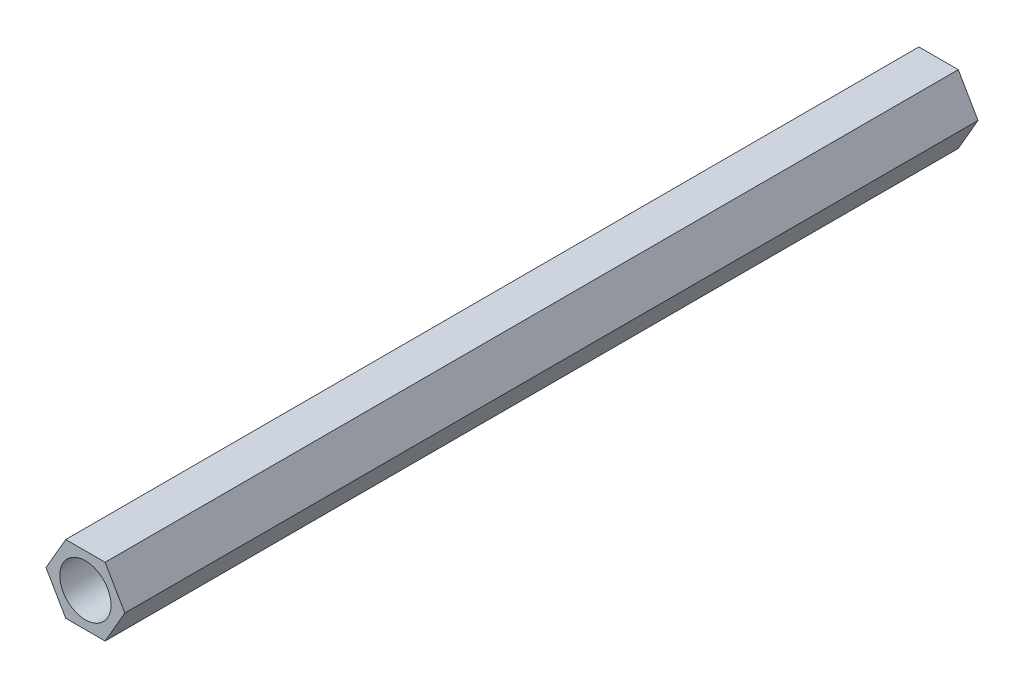
ISO-10303-21;
HEADER;
FILE_DESCRIPTION(('STEP AP214'),'2;1');
FILE_NAME('part.step','',(''),(''),'','','');
FILE_SCHEMA(('AUTOMOTIVE_DESIGN { 1 0 10303 214 1 1 1 1 }'));
ENDSEC;
DATA;
#1=APPLICATION_CONTEXT('core data for automotive mechanical design processes');
#2=APPLICATION_PROTOCOL_DEFINITION('international standard','automotive_design',2000,#1);
#3=PRODUCT_CONTEXT('',#1,'mechanical');
#4=PRODUCT('Part','Part','',(#3));
#5=PRODUCT_RELATED_PRODUCT_CATEGORY('part','',(#4));
#6=PRODUCT_DEFINITION_FORMATION('','',#4);
#7=PRODUCT_DEFINITION_CONTEXT('part definition',#1,'design');
#8=PRODUCT_DEFINITION('design','',#6,#7);
#9=PRODUCT_DEFINITION_SHAPE('','',#8);
#10=(LENGTH_UNIT() NAMED_UNIT(*) SI_UNIT(.MILLI.,.METRE.));
#11=(NAMED_UNIT(*) PLANE_ANGLE_UNIT() SI_UNIT($,.RADIAN.));
#12=(NAMED_UNIT(*) SI_UNIT($,.STERADIAN.) SOLID_ANGLE_UNIT());
#13=UNCERTAINTY_MEASURE_WITH_UNIT(LENGTH_MEASURE(1.E-05),#10,'distance_accuracy_value','');
#14=(GEOMETRIC_REPRESENTATION_CONTEXT(3) GLOBAL_UNCERTAINTY_ASSIGNED_CONTEXT((#13)) GLOBAL_UNIT_ASSIGNED_CONTEXT((#10,
#11,#12)) REPRESENTATION_CONTEXT('',''));
#15=CARTESIAN_POINT('',(0.,0.,0.));
#16=DIRECTION('',(0.,0.,1.));
#17=DIRECTION('',(1.,0.,0.));
#18=AXIS2_PLACEMENT_3D('',#15,#16,#17);
#19=CARTESIAN_POINT('',(0.,0.,50.));
#20=DIRECTION('',(0.,0.,1.));
#21=DIRECTION('',(1.,0.,0.));
#22=AXIS2_PLACEMENT_3D('',#19,#20,#21);
#23=PLANE('',#22);
#24=DIRECTION('',(1.,0.,0.));
#25=VECTOR('',#24,1.);
#26=CARTESIAN_POINT('',(-1.15470053837925,-2.,50.));
#27=LINE('',#26,#25);
#28=CARTESIAN_POINT('',(-1.15470053837925,-2.,50.));
#29=VERTEX_POINT('',#28);
#30=CARTESIAN_POINT('',(1.15470053837925,-2.,50.));
#31=VERTEX_POINT('',#30);
#32=EDGE_CURVE('E128',#29,#31,#27,.T.);
#33=ORIENTED_EDGE('',*,*,#32,.T.);
#34=DIRECTION('',(0.5,0.866025403784438,0.));
#35=VECTOR('',#34,1.);
#36=CARTESIAN_POINT('',(1.15470053837925,-2.,50.));
#37=LINE('',#36,#35);
#38=CARTESIAN_POINT('',(2.3094010767585,0.,50.));
#39=VERTEX_POINT('',#38);
#40=EDGE_CURVE('E86',#31,#39,#37,.T.);
#41=ORIENTED_EDGE('',*,*,#40,.T.);
#42=DIRECTION('',(-0.5,0.866025403784438,0.));
#43=VECTOR('',#42,1.);
#44=CARTESIAN_POINT('',(2.3094010767585,0.,50.));
#45=LINE('',#44,#43);
#46=CARTESIAN_POINT('',(1.15470053837925,2.,50.));
#47=VERTEX_POINT('',#46);
#48=EDGE_CURVE('E99',#39,#47,#45,.T.);
#49=ORIENTED_EDGE('',*,*,#48,.T.);
#50=DIRECTION('',(-1.,0.,0.));
#51=VECTOR('',#50,1.);
#52=CARTESIAN_POINT('',(1.15470053837925,2.,50.));
#53=LINE('',#52,#51);
#54=CARTESIAN_POINT('',(-1.15470053837925,2.,50.));
#55=VERTEX_POINT('',#54);
#56=EDGE_CURVE('E93',#47,#55,#53,.T.);
#57=ORIENTED_EDGE('',*,*,#56,.T.);
#58=DIRECTION('',(-0.5,-0.866025403784439,0.));
#59=VECTOR('',#58,1.);
#60=CARTESIAN_POINT('',(-1.15470053837925,2.,50.));
#61=LINE('',#60,#59);
#62=CARTESIAN_POINT('',(-2.3094010767585,0.,50.));
#63=VERTEX_POINT('',#62);
#64=EDGE_CURVE('E97',#55,#63,#61,.T.);
#65=ORIENTED_EDGE('',*,*,#64,.T.);
#66=DIRECTION('',(0.5,-0.866025403784438,0.));
#67=VECTOR('',#66,1.);
#68=CARTESIAN_POINT('',(-2.3094010767585,0.,50.));
#69=LINE('',#68,#67);
#70=EDGE_CURVE('E49',#63,#29,#69,.T.);
#71=ORIENTED_EDGE('',*,*,#70,.T.);
#72=EDGE_LOOP('',(#33,#41,#49,#57,#65,#71));
#73=FACE_BOUND('',#72,.T.);
#74=CARTESIAN_POINT('',(0.,0.,50.));
#75=DIRECTION('',(0.,0.,1.));
#76=DIRECTION('',(1.,0.,0.));
#77=AXIS2_PLACEMENT_3D('',#74,#75,#76);
#78=CIRCLE('',#77,1.5);
#79=CARTESIAN_POINT('',(1.5,0.,50.));
#80=VERTEX_POINT('',#79);
#81=EDGE_CURVE('E121',#80,#80,#78,.T.);
#82=ORIENTED_EDGE('',*,*,#81,.F.);
#83=EDGE_LOOP('',(#82));
#84=FACE_BOUND('',#83,.T.);
#85=ADVANCED_FACE('F32',(#73,#84),#23,.T.);
#86=CARTESIAN_POINT('',(0.,0.,0.));
#87=DIRECTION('',(0.,0.,1.));
#88=DIRECTION('',(1.,0.,0.));
#89=AXIS2_PLACEMENT_3D('',#86,#87,#88);
#90=PLANE('',#89);
#91=DIRECTION('',(1.,0.,0.));
#92=VECTOR('',#91,1.);
#93=CARTESIAN_POINT('',(-1.15470053837925,-2.,0.));
#94=LINE('',#93,#92);
#95=CARTESIAN_POINT('',(-1.15470053837925,-2.,0.));
#96=VERTEX_POINT('',#95);
#97=CARTESIAN_POINT('',(1.15470053837925,-2.,0.));
#98=VERTEX_POINT('',#97);
#99=EDGE_CURVE('E117',#96,#98,#94,.T.);
#100=ORIENTED_EDGE('',*,*,#99,.F.);
#101=DIRECTION('',(0.5,-0.866025403784438,0.));
#102=VECTOR('',#101,1.);
#103=CARTESIAN_POINT('',(-2.3094010767585,0.,0.));
#104=LINE('',#103,#102);
#105=CARTESIAN_POINT('',(-2.3094010767585,0.,0.));
#106=VERTEX_POINT('',#105);
#107=EDGE_CURVE('E78',#106,#96,#104,.T.);
#108=ORIENTED_EDGE('',*,*,#107,.F.);
#109=DIRECTION('',(-0.5,-0.866025403784439,0.));
#110=VECTOR('',#109,1.);
#111=CARTESIAN_POINT('',(-1.15470053837925,2.,0.));
#112=LINE('',#111,#110);
#113=CARTESIAN_POINT('',(-1.15470053837925,2.,0.));
#114=VERTEX_POINT('',#113);
#115=EDGE_CURVE('E72',#114,#106,#112,.T.);
#116=ORIENTED_EDGE('',*,*,#115,.F.);
#117=DIRECTION('',(-1.,0.,0.));
#118=VECTOR('',#117,1.);
#119=CARTESIAN_POINT('',(1.15470053837925,2.,0.));
#120=LINE('',#119,#118);
#121=CARTESIAN_POINT('',(1.15470053837925,2.,0.));
#122=VERTEX_POINT('',#121);
#123=EDGE_CURVE('E107',#122,#114,#120,.T.);
#124=ORIENTED_EDGE('',*,*,#123,.F.);
#125=DIRECTION('',(-0.5,0.866025403784438,0.));
#126=VECTOR('',#125,1.);
#127=CARTESIAN_POINT('',(2.3094010767585,0.,0.));
#128=LINE('',#127,#126);
#129=CARTESIAN_POINT('',(2.3094010767585,0.,0.));
#130=VERTEX_POINT('',#129);
#131=EDGE_CURVE('E123',#130,#122,#128,.T.);
#132=ORIENTED_EDGE('',*,*,#131,.F.);
#133=DIRECTION('',(0.5,0.866025403784438,0.));
#134=VECTOR('',#133,1.);
#135=CARTESIAN_POINT('',(1.15470053837925,-2.,0.));
#136=LINE('',#135,#134);
#137=EDGE_CURVE('E120',#98,#130,#136,.T.);
#138=ORIENTED_EDGE('',*,*,#137,.F.);
#139=EDGE_LOOP('',(#100,#108,#116,#124,#132,#138));
#140=FACE_BOUND('',#139,.T.);
#141=CARTESIAN_POINT('',(0.,0.,0.));
#142=DIRECTION('',(0.,0.,1.));
#143=DIRECTION('',(1.,0.,0.));
#144=AXIS2_PLACEMENT_3D('',#141,#142,#143);
#145=CIRCLE('',#144,1.5);
#146=CARTESIAN_POINT('',(1.5,0.,0.));
#147=VERTEX_POINT('',#146);
#148=EDGE_CURVE('E221',#147,#147,#145,.T.);
#149=ORIENTED_EDGE('',*,*,#148,.T.);
#150=EDGE_LOOP('',(#149));
#151=FACE_BOUND('',#150,.T.);
#152=ADVANCED_FACE('F137',(#140,#151),#90,.F.);
#153=CARTESIAN_POINT('',(-1.15470053837925,-2.,50.));
#154=DIRECTION('',(0.,1.,0.));
#155=DIRECTION('',(0.,0.,1.));
#156=AXIS2_PLACEMENT_3D('',#153,#154,#155);
#157=PLANE('',#156);
#158=ORIENTED_EDGE('',*,*,#99,.T.);
#159=DIRECTION('',(0.,0.,-1.));
#160=VECTOR('',#159,1.);
#161=CARTESIAN_POINT('',(1.15470053837925,-2.,50.));
#162=LINE('',#161,#160);
#163=EDGE_CURVE('E11',#31,#98,#162,.T.);
#164=ORIENTED_EDGE('',*,*,#163,.F.);
#165=ORIENTED_EDGE('',*,*,#32,.F.);
#166=DIRECTION('',(0.,0.,-1.));
#167=VECTOR('',#166,1.);
#168=CARTESIAN_POINT('',(-1.15470053837925,-2.,50.));
#169=LINE('',#168,#167);
#170=EDGE_CURVE('E113',#29,#96,#169,.T.);
#171=ORIENTED_EDGE('',*,*,#170,.T.);
#172=EDGE_LOOP('',(#158,#164,#165,#171));
#173=FACE_BOUND('',#172,.T.);
#174=ADVANCED_FACE('F34',(#173),#157,.F.);
#175=CARTESIAN_POINT('',(1.15470053837925,-2.,50.));
#176=DIRECTION('',(-0.866025403784438,0.5,0.));
#177=DIRECTION('',(-0.5,-0.866025403784439,0.));
#178=AXIS2_PLACEMENT_3D('',#175,#176,#177);
#179=PLANE('',#178);
#180=ORIENTED_EDGE('',*,*,#137,.T.);
#181=DIRECTION('',(0.,0.,-1.));
#182=VECTOR('',#181,1.);
#183=CARTESIAN_POINT('',(2.3094010767585,0.,50.));
#184=LINE('',#183,#182);
#185=EDGE_CURVE('E41',#39,#130,#184,.T.);
#186=ORIENTED_EDGE('',*,*,#185,.F.);
#187=ORIENTED_EDGE('',*,*,#40,.F.);
#188=ORIENTED_EDGE('',*,*,#163,.T.);
#189=EDGE_LOOP('',(#180,#186,#187,#188));
#190=FACE_BOUND('',#189,.T.);
#191=ADVANCED_FACE('F162',(#190),#179,.F.);
#192=CARTESIAN_POINT('',(2.3094010767585,0.,50.));
#193=DIRECTION('',(-0.866025403784438,-0.5,0.));
#194=DIRECTION('',(0.5,-0.866025403784439,0.));
#195=AXIS2_PLACEMENT_3D('',#192,#193,#194);
#196=PLANE('',#195);
#197=ORIENTED_EDGE('',*,*,#131,.T.);
#198=DIRECTION('',(0.,0.,-1.));
#199=VECTOR('',#198,1.);
#200=CARTESIAN_POINT('',(1.15470053837925,2.,50.));
#201=LINE('',#200,#199);
#202=EDGE_CURVE('E108',#47,#122,#201,.T.);
#203=ORIENTED_EDGE('',*,*,#202,.F.);
#204=ORIENTED_EDGE('',*,*,#48,.F.);
#205=ORIENTED_EDGE('',*,*,#185,.T.);
#206=EDGE_LOOP('',(#197,#203,#204,#205));
#207=FACE_BOUND('',#206,.T.);
#208=ADVANCED_FACE('F134',(#207),#196,.F.);
#209=CARTESIAN_POINT('',(1.15470053837925,2.,50.));
#210=DIRECTION('',(0.,-1.,0.));
#211=DIRECTION('',(1.,0.,0.));
#212=AXIS2_PLACEMENT_3D('',#209,#210,#211);
#213=PLANE('',#212);
#214=ORIENTED_EDGE('',*,*,#123,.T.);
#215=DIRECTION('',(0.,0.,-1.));
#216=VECTOR('',#215,1.);
#217=CARTESIAN_POINT('',(-1.15470053837925,2.,50.));
#218=LINE('',#217,#216);
#219=EDGE_CURVE('E104',#55,#114,#218,.T.);
#220=ORIENTED_EDGE('',*,*,#219,.F.);
#221=ORIENTED_EDGE('',*,*,#56,.F.);
#222=ORIENTED_EDGE('',*,*,#202,.T.);
#223=EDGE_LOOP('',(#214,#220,#221,#222));
#224=FACE_BOUND('',#223,.T.);
#225=ADVANCED_FACE('F105',(#224),#213,.F.);
#226=CARTESIAN_POINT('',(-1.15470053837925,2.,50.));
#227=DIRECTION('',(0.866025403784439,-0.5,0.));
#228=DIRECTION('',(0.5,0.866025403784439,0.));
#229=AXIS2_PLACEMENT_3D('',#226,#227,#228);
#230=PLANE('',#229);
#231=ORIENTED_EDGE('',*,*,#115,.T.);
#232=DIRECTION('',(0.,0.,-1.));
#233=VECTOR('',#232,1.);
#234=CARTESIAN_POINT('',(-2.3094010767585,0.,50.));
#235=LINE('',#234,#233);
#236=EDGE_CURVE('E109',#63,#106,#235,.T.);
#237=ORIENTED_EDGE('',*,*,#236,.F.);
#238=ORIENTED_EDGE('',*,*,#64,.F.);
#239=ORIENTED_EDGE('',*,*,#219,.T.);
#240=EDGE_LOOP('',(#231,#237,#238,#239));
#241=FACE_BOUND('',#240,.T.);
#242=ADVANCED_FACE('F111',(#241),#230,.F.);
#243=CARTESIAN_POINT('',(-2.3094010767585,0.,50.));
#244=DIRECTION('',(0.866025403784438,0.5,0.));
#245=DIRECTION('',(-0.5,0.866025403784439,0.));
#246=AXIS2_PLACEMENT_3D('',#243,#244,#245);
#247=PLANE('',#246);
#248=ORIENTED_EDGE('',*,*,#107,.T.);
#249=ORIENTED_EDGE('',*,*,#170,.F.);
#250=ORIENTED_EDGE('',*,*,#70,.F.);
#251=ORIENTED_EDGE('',*,*,#236,.T.);
#252=EDGE_LOOP('',(#248,#249,#250,#251));
#253=FACE_BOUND('',#252,.T.);
#254=ADVANCED_FACE('F142',(#253),#247,.F.);
#255=CARTESIAN_POINT('',(0.,0.,50.));
#256=DIRECTION('',(0.,0.,-1.));
#257=DIRECTION('',(-1.,0.,0.));
#258=AXIS2_PLACEMENT_3D('',#255,#256,#257);
#259=CYLINDRICAL_SURFACE('',#258,1.5);
#260=ORIENTED_EDGE('',*,*,#81,.T.);
#261=EDGE_LOOP('',(#260));
#262=FACE_BOUND('',#261,.T.);
#263=ORIENTED_EDGE('',*,*,#148,.F.);
#264=EDGE_LOOP('',(#263));
#265=FACE_BOUND('',#264,.T.);
#266=ADVANCED_FACE('F144',(#262,#265),#259,.F.);
#267=CLOSED_SHELL('',(#85,#152,#174,#191,#208,#225,#242,#254,#266));
#268=MANIFOLD_SOLID_BREP('B2',#267);
#269=ADVANCED_BREP_SHAPE_REPRESENTATION('',(#18,#268),#14);
#270=SHAPE_DEFINITION_REPRESENTATION(#9,#269);
ENDSEC;
END-ISO-10303-21;
